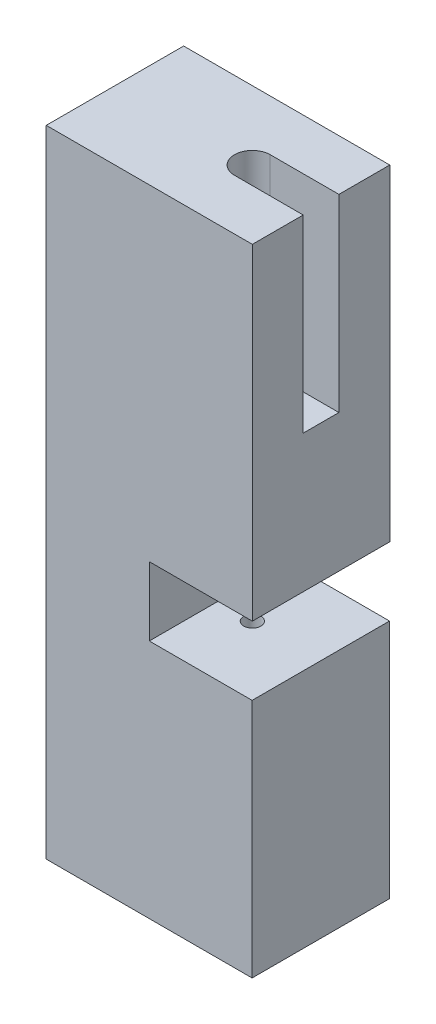
ISO-10303-21;
HEADER;
FILE_DESCRIPTION(('STEP AP214'),'2;1');
FILE_NAME('part.step','',(''),(''),'','','');
FILE_SCHEMA(('AUTOMOTIVE_DESIGN { 1 0 10303 214 1 1 1 1 }'));
ENDSEC;
DATA;
#1=APPLICATION_CONTEXT('core data for automotive mechanical design processes');
#2=APPLICATION_PROTOCOL_DEFINITION('international standard','automotive_design',2000,#1);
#3=PRODUCT_CONTEXT('',#1,'mechanical');
#4=PRODUCT('Part','Part','',(#3));
#5=PRODUCT_RELATED_PRODUCT_CATEGORY('part','',(#4));
#6=PRODUCT_DEFINITION_FORMATION('','',#4);
#7=PRODUCT_DEFINITION_CONTEXT('part definition',#1,'design');
#8=PRODUCT_DEFINITION('design','',#6,#7);
#9=PRODUCT_DEFINITION_SHAPE('','',#8);
#10=(LENGTH_UNIT() NAMED_UNIT(*) SI_UNIT(.MILLI.,.METRE.));
#11=(NAMED_UNIT(*) PLANE_ANGLE_UNIT() SI_UNIT($,.RADIAN.));
#12=(NAMED_UNIT(*) SI_UNIT($,.STERADIAN.) SOLID_ANGLE_UNIT());
#13=UNCERTAINTY_MEASURE_WITH_UNIT(LENGTH_MEASURE(1.E-05),#10,'distance_accuracy_value','');
#14=(GEOMETRIC_REPRESENTATION_CONTEXT(3) GLOBAL_UNCERTAINTY_ASSIGNED_CONTEXT((#13)) GLOBAL_UNIT_ASSIGNED_CONTEXT((#10,
#11,#12)) REPRESENTATION_CONTEXT('',''));
#15=CARTESIAN_POINT('',(0.,0.,0.));
#16=DIRECTION('',(0.,0.,1.));
#17=DIRECTION('',(1.,0.,0.));
#18=AXIS2_PLACEMENT_3D('',#15,#16,#17);
#19=CARTESIAN_POINT('',(0.,25.4,0.));
#20=DIRECTION('',(0.,-1.,0.));
#21=DIRECTION('',(0.,0.,-1.));
#22=AXIS2_PLACEMENT_3D('',#19,#20,#21);
#23=PLANE('',#22);
#24=CARTESIAN_POINT('',(6.34999999999999,25.4,0.));
#25=DIRECTION('',(0.,1.,0.));
#26=DIRECTION('',(0.,0.,1.));
#27=AXIS2_PLACEMENT_3D('',#24,#25,#26);
#28=CIRCLE('',#27,3.18);
#29=CARTESIAN_POINT('',(6.34999999999999,25.4,3.18));
#30=VERTEX_POINT('',#29);
#31=EDGE_CURVE('E242',#30,#30,#28,.T.);
#32=ORIENTED_EDGE('',*,*,#31,.F.);
#33=EDGE_LOOP('',(#32));
#34=FACE_BOUND('',#33,.T.);
#35=DIRECTION('',(-1.,0.,0.));
#36=VECTOR('',#35,1.);
#37=CARTESIAN_POINT('',(6.34999999999999,25.4,3.302));
#38=LINE('',#37,#36);
#39=CARTESIAN_POINT('',(19.05,25.4,3.302));
#40=VERTEX_POINT('',#39);
#41=CARTESIAN_POINT('',(6.34999999999999,25.4,3.302));
#42=VERTEX_POINT('',#41);
#43=EDGE_CURVE('E146',#40,#42,#38,.T.);
#44=ORIENTED_EDGE('',*,*,#43,.F.);
#45=DIRECTION('',(0.,0.,-1.));
#46=VECTOR('',#45,1.);
#47=CARTESIAN_POINT('',(19.05,25.4,12.7));
#48=LINE('',#47,#46);
#49=CARTESIAN_POINT('',(19.05,25.4,-3.302));
#50=VERTEX_POINT('',#49);
#51=EDGE_CURVE('E202',#40,#50,#48,.T.);
#52=ORIENTED_EDGE('',*,*,#51,.T.);
#53=DIRECTION('',(1.,0.,0.));
#54=VECTOR('',#53,1.);
#55=CARTESIAN_POINT('',(6.34999999999999,25.4,-3.302));
#56=LINE('',#55,#54);
#57=CARTESIAN_POINT('',(6.34999999999999,25.4,-3.302));
#58=VERTEX_POINT('',#57);
#59=EDGE_CURVE('E59',#58,#50,#56,.T.);
#60=ORIENTED_EDGE('',*,*,#59,.F.);
#61=CARTESIAN_POINT('',(6.34999999999999,25.4,0.));
#62=DIRECTION('',(0.,-1.,0.));
#63=DIRECTION('',(0.,0.,1.));
#64=AXIS2_PLACEMENT_3D('',#61,#62,#63);
#65=CIRCLE('',#64,3.302);
#66=EDGE_CURVE('E54',#42,#58,#65,.T.);
#67=ORIENTED_EDGE('',*,*,#66,.F.);
#68=EDGE_LOOP('',(#44,#52,#60,#67));
#69=FACE_BOUND('',#68,.T.);
#70=ADVANCED_FACE('F37',(#34,#69),#23,.F.);
#71=CARTESIAN_POINT('',(19.05,25.4,12.7));
#72=DIRECTION('',(-1.,0.,0.));
#73=DIRECTION('',(0.,0.,1.));
#74=AXIS2_PLACEMENT_3D('',#71,#72,#73);
#75=PLANE('',#74);
#76=DIRECTION('',(0.,0.,-1.));
#77=VECTOR('',#76,1.);
#78=CARTESIAN_POINT('',(19.05,0.,12.7));
#79=LINE('',#78,#77);
#80=CARTESIAN_POINT('',(19.05,0.,12.7));
#81=VERTEX_POINT('',#80);
#82=CARTESIAN_POINT('',(19.05,0.,-12.7));
#83=VERTEX_POINT('',#82);
#84=EDGE_CURVE('E212',#81,#83,#79,.T.);
#85=ORIENTED_EDGE('',*,*,#84,.T.);
#86=DIRECTION('',(0.,-1.,0.));
#87=VECTOR('',#86,1.);
#88=CARTESIAN_POINT('',(19.05,25.4,-12.7));
#89=LINE('',#88,#87);
#90=CARTESIAN_POINT('',(19.05,60.325,-12.7));
#91=VERTEX_POINT('',#90);
#92=EDGE_CURVE('E11',#91,#83,#89,.T.);
#93=ORIENTED_EDGE('',*,*,#92,.F.);
#94=DIRECTION('',(0.,0.,-1.));
#95=VECTOR('',#94,1.);
#96=CARTESIAN_POINT('',(19.05,60.325,-3.302));
#97=LINE('',#96,#95);
#98=CARTESIAN_POINT('',(19.05,60.325,-3.302));
#99=VERTEX_POINT('',#98);
#100=EDGE_CURVE('E136',#99,#91,#97,.T.);
#101=ORIENTED_EDGE('',*,*,#100,.F.);
#102=DIRECTION('',(0.,-1.,0.));
#103=VECTOR('',#102,1.);
#104=CARTESIAN_POINT('',(19.05,60.325,-3.302));
#105=LINE('',#104,#103);
#106=EDGE_CURVE('E132',#99,#50,#105,.T.);
#107=ORIENTED_EDGE('',*,*,#106,.T.);
#108=ORIENTED_EDGE('',*,*,#51,.F.);
#109=DIRECTION('',(0.,-1.,0.));
#110=VECTOR('',#109,1.);
#111=CARTESIAN_POINT('',(19.05,60.325,3.302));
#112=LINE('',#111,#110);
#113=CARTESIAN_POINT('',(19.05,60.325,3.302));
#114=VERTEX_POINT('',#113);
#115=EDGE_CURVE('E154',#114,#40,#112,.T.);
#116=ORIENTED_EDGE('',*,*,#115,.F.);
#117=DIRECTION('',(0.,0.,-1.));
#118=VECTOR('',#117,1.);
#119=CARTESIAN_POINT('',(19.05,60.325,3.302));
#120=LINE('',#119,#118);
#121=CARTESIAN_POINT('',(19.05,60.325,12.7));
#122=VERTEX_POINT('',#121);
#123=EDGE_CURVE('E341',#122,#114,#120,.T.);
#124=ORIENTED_EDGE('',*,*,#123,.F.);
#125=DIRECTION('',(0.,-1.,0.));
#126=VECTOR('',#125,1.);
#127=CARTESIAN_POINT('',(19.05,25.4,12.7));
#128=LINE('',#127,#126);
#129=EDGE_CURVE('E205',#122,#81,#128,.T.);
#130=ORIENTED_EDGE('',*,*,#129,.T.);
#131=EDGE_LOOP('',(#85,#93,#101,#107,#108,#116,#124,#130));
#132=FACE_BOUND('',#131,.T.);
#133=ADVANCED_FACE('F39',(#132),#75,.F.);
#134=CARTESIAN_POINT('',(-19.05,25.4,-12.7));
#135=DIRECTION('',(0.,0.,1.));
#136=DIRECTION('',(1.,0.,0.));
#137=AXIS2_PLACEMENT_3D('',#134,#135,#136);
#138=PLANE('',#137);
#139=DIRECTION('',(-1.,0.,0.));
#140=VECTOR('',#139,1.);
#141=CARTESIAN_POINT('',(-19.05,0.,-12.7));
#142=LINE('',#141,#140);
#143=CARTESIAN_POINT('',(0.,0.,-12.7));
#144=VERTEX_POINT('',#143);
#145=EDGE_CURVE('E215',#83,#144,#142,.T.);
#146=ORIENTED_EDGE('',*,*,#145,.T.);
#147=DIRECTION('',(0.,1.,0.));
#148=VECTOR('',#147,1.);
#149=CARTESIAN_POINT('',(0.,-12.7,-12.7));
#150=LINE('',#149,#148);
#151=CARTESIAN_POINT('',(0.,-12.7,-12.7));
#152=VERTEX_POINT('',#151);
#153=EDGE_CURVE('E231',#152,#144,#150,.T.);
#154=ORIENTED_EDGE('',*,*,#153,.F.);
#155=DIRECTION('',(1.,0.,0.));
#156=VECTOR('',#155,1.);
#157=CARTESIAN_POINT('',(-19.05,-12.7,-12.7));
#158=LINE('',#157,#156);
#159=CARTESIAN_POINT('',(19.0049783903987,-12.7,-12.7));
#160=VERTEX_POINT('',#159);
#161=EDGE_CURVE('E166',#152,#160,#158,.T.);
#162=ORIENTED_EDGE('',*,*,#161,.T.);
#163=DIRECTION('',(0.,1.,0.));
#164=VECTOR('',#163,1.);
#165=CARTESIAN_POINT('',(19.0049783903987,-57.15,-12.7));
#166=LINE('',#165,#164);
#167=CARTESIAN_POINT('',(19.0049783903987,-57.15,-12.7));
#168=VERTEX_POINT('',#167);
#169=EDGE_CURVE('E228',#168,#160,#166,.T.);
#170=ORIENTED_EDGE('',*,*,#169,.F.);
#171=DIRECTION('',(1.,0.,0.));
#172=VECTOR('',#171,1.);
#173=CARTESIAN_POINT('',(-19.05,-57.15,-12.7));
#174=LINE('',#173,#172);
#175=CARTESIAN_POINT('',(-19.05,-57.15,-12.7));
#176=VERTEX_POINT('',#175);
#177=EDGE_CURVE('E170',#176,#168,#174,.T.);
#178=ORIENTED_EDGE('',*,*,#177,.F.);
#179=DIRECTION('',(0.,-1.,0.));
#180=VECTOR('',#179,1.);
#181=CARTESIAN_POINT('',(-19.05,25.4,-12.7));
#182=LINE('',#181,#180);
#183=CARTESIAN_POINT('',(-19.05,60.325,-12.7));
#184=VERTEX_POINT('',#183);
#185=EDGE_CURVE('E46',#184,#176,#182,.T.);
#186=ORIENTED_EDGE('',*,*,#185,.F.);
#187=DIRECTION('',(-1.,0.,0.));
#188=VECTOR('',#187,1.);
#189=CARTESIAN_POINT('',(-19.05,60.325,-12.7));
#190=LINE('',#189,#188);
#191=EDGE_CURVE('E347',#91,#184,#190,.T.);
#192=ORIENTED_EDGE('',*,*,#191,.F.);
#193=ORIENTED_EDGE('',*,*,#92,.T.);
#194=EDGE_LOOP('',(#146,#154,#162,#170,#178,#186,#192,#193));
#195=FACE_BOUND('',#194,.T.);
#196=ADVANCED_FACE('F294',(#195),#138,.F.);
#197=CARTESIAN_POINT('',(-19.05,25.4,12.7));
#198=DIRECTION('',(1.,0.,0.));
#199=DIRECTION('',(0.,0.,-1.));
#200=AXIS2_PLACEMENT_3D('',#197,#198,#199);
#201=PLANE('',#200);
#202=CARTESIAN_POINT('',(-19.05,12.7,0.));
#203=DIRECTION('',(-1.,0.,0.));
#204=DIRECTION('',(0.,0.,1.));
#205=AXIS2_PLACEMENT_3D('',#202,#203,#204);
#206=CIRCLE('',#205,2.7051);
#207=CARTESIAN_POINT('',(-19.05,12.7,2.7051));
#208=VERTEX_POINT('',#207);
#209=EDGE_CURVE('E249',#208,#208,#206,.T.);
#210=ORIENTED_EDGE('',*,*,#209,.F.);
#211=EDGE_LOOP('',(#210));
#212=FACE_BOUND('',#211,.T.);
#213=ORIENTED_EDGE('',*,*,#185,.T.);
#214=DIRECTION('',(0.,0.,-1.));
#215=VECTOR('',#214,1.);
#216=CARTESIAN_POINT('',(-19.05,-57.15,12.7));
#217=LINE('',#216,#215);
#218=CARTESIAN_POINT('',(-19.05,-57.15,12.7));
#219=VERTEX_POINT('',#218);
#220=EDGE_CURVE('E167',#219,#176,#217,.T.);
#221=ORIENTED_EDGE('',*,*,#220,.F.);
#222=DIRECTION('',(0.,-1.,0.));
#223=VECTOR('',#222,1.);
#224=CARTESIAN_POINT('',(-19.05,25.4,12.7));
#225=LINE('',#224,#223);
#226=CARTESIAN_POINT('',(-19.05,60.325,12.7));
#227=VERTEX_POINT('',#226);
#228=EDGE_CURVE('E333',#227,#219,#225,.T.);
#229=ORIENTED_EDGE('',*,*,#228,.F.);
#230=DIRECTION('',(0.,0.,1.));
#231=VECTOR('',#230,1.);
#232=CARTESIAN_POINT('',(-19.05,60.325,12.7));
#233=LINE('',#232,#231);
#234=EDGE_CURVE('E335',#184,#227,#233,.T.);
#235=ORIENTED_EDGE('',*,*,#234,.F.);
#236=EDGE_LOOP('',(#213,#221,#229,#235));
#237=FACE_BOUND('',#236,.T.);
#238=ADVANCED_FACE('F300',(#212,#237),#201,.F.);
#239=CARTESIAN_POINT('',(-19.05,25.4,12.7));
#240=DIRECTION('',(0.,0.,-1.));
#241=DIRECTION('',(-1.,0.,0.));
#242=AXIS2_PLACEMENT_3D('',#239,#240,#241);
#243=PLANE('',#242);
#244=ORIENTED_EDGE('',*,*,#228,.T.);
#245=DIRECTION('',(-1.,0.,0.));
#246=VECTOR('',#245,1.);
#247=CARTESIAN_POINT('',(19.0049783903987,-57.15,12.7));
#248=LINE('',#247,#246);
#249=CARTESIAN_POINT('',(19.0049783903987,-57.15,12.7));
#250=VERTEX_POINT('',#249);
#251=EDGE_CURVE('E175',#250,#219,#248,.T.);
#252=ORIENTED_EDGE('',*,*,#251,.F.);
#253=DIRECTION('',(0.,1.,0.));
#254=VECTOR('',#253,1.);
#255=CARTESIAN_POINT('',(19.0049783903987,-57.15,12.7));
#256=LINE('',#255,#254);
#257=CARTESIAN_POINT('',(19.0049783903987,-12.7,12.7));
#258=VERTEX_POINT('',#257);
#259=EDGE_CURVE('E178',#250,#258,#256,.T.);
#260=ORIENTED_EDGE('',*,*,#259,.T.);
#261=DIRECTION('',(-1.,0.,0.));
#262=VECTOR('',#261,1.);
#263=CARTESIAN_POINT('',(19.0049783903987,-12.7,12.7));
#264=LINE('',#263,#262);
#265=CARTESIAN_POINT('',(0.,-12.7,12.7));
#266=VERTEX_POINT('',#265);
#267=EDGE_CURVE('E171',#258,#266,#264,.T.);
#268=ORIENTED_EDGE('',*,*,#267,.T.);
#269=DIRECTION('',(0.,1.,0.));
#270=VECTOR('',#269,1.);
#271=CARTESIAN_POINT('',(0.,-12.7,12.7));
#272=LINE('',#271,#270);
#273=CARTESIAN_POINT('',(0.,0.,12.7));
#274=VERTEX_POINT('',#273);
#275=EDGE_CURVE('E196',#266,#274,#272,.T.);
#276=ORIENTED_EDGE('',*,*,#275,.T.);
#277=DIRECTION('',(1.,0.,0.));
#278=VECTOR('',#277,1.);
#279=CARTESIAN_POINT('',(-19.05,0.,12.7));
#280=LINE('',#279,#278);
#281=EDGE_CURVE('E206',#274,#81,#280,.T.);
#282=ORIENTED_EDGE('',*,*,#281,.T.);
#283=ORIENTED_EDGE('',*,*,#129,.F.);
#284=DIRECTION('',(1.,0.,0.));
#285=VECTOR('',#284,1.);
#286=CARTESIAN_POINT('',(19.05,60.325,12.7));
#287=LINE('',#286,#285);
#288=EDGE_CURVE('E344',#227,#122,#287,.T.);
#289=ORIENTED_EDGE('',*,*,#288,.F.);
#290=EDGE_LOOP('',(#244,#252,#260,#268,#276,#282,#283,#289));
#291=FACE_BOUND('',#290,.T.);
#292=ADVANCED_FACE('F285',(#291),#243,.F.);
#293=CARTESIAN_POINT('',(0.,0.,0.));
#294=DIRECTION('',(0.,-1.,0.));
#295=DIRECTION('',(0.,0.,-1.));
#296=AXIS2_PLACEMENT_3D('',#293,#294,#295);
#297=PLANE('',#296);
#298=DIRECTION('',(0.,0.,1.));
#299=VECTOR('',#298,1.);
#300=CARTESIAN_POINT('',(0.,0.,-12.7));
#301=LINE('',#300,#299);
#302=EDGE_CURVE('E197',#144,#274,#301,.T.);
#303=ORIENTED_EDGE('',*,*,#302,.F.);
#304=ORIENTED_EDGE('',*,*,#145,.F.);
#305=ORIENTED_EDGE('',*,*,#84,.F.);
#306=ORIENTED_EDGE('',*,*,#281,.F.);
#307=EDGE_LOOP('',(#303,#304,#305,#306));
#308=FACE_BOUND('',#307,.T.);
#309=CARTESIAN_POINT('',(6.34999999999999,0.,0.));
#310=DIRECTION('',(0.,-1.,0.));
#311=DIRECTION('',(0.,0.,-1.));
#312=AXIS2_PLACEMENT_3D('',#309,#310,#311);
#313=CIRCLE('',#312,1.5875);
#314=CARTESIAN_POINT('',(6.34999999999999,0.,-1.5875));
#315=VERTEX_POINT('',#314);
#316=EDGE_CURVE('E234',#315,#315,#313,.T.);
#317=ORIENTED_EDGE('',*,*,#316,.F.);
#318=EDGE_LOOP('',(#317));
#319=FACE_BOUND('',#318,.T.);
#320=ADVANCED_FACE('F280',(#308,#319),#297,.T.);
#321=CARTESIAN_POINT('',(-1.82,12.7,0.));
#322=DIRECTION('',(-1.,0.,0.));
#323=DIRECTION('',(0.,0.,1.));
#324=AXIS2_PLACEMENT_3D('',#321,#322,#323);
#325=CONICAL_SURFACE('',#324,2.7051,1.02974425867665);
#326=CARTESIAN_POINT('',(-1.82,12.7,0.));
#327=DIRECTION('',(-1.,0.,0.));
#328=DIRECTION('',(0.,0.,1.));
#329=AXIS2_PLACEMENT_3D('',#326,#327,#328);
#330=CIRCLE('',#329,2.7051);
#331=CARTESIAN_POINT('',(-1.82,12.7,2.7051));
#332=VERTEX_POINT('',#331);
#333=EDGE_CURVE('E210',#332,#332,#330,.T.);
#334=ORIENTED_EDGE('',*,*,#333,.T.);
#335=EDGE_LOOP('',(#334));
#336=FACE_BOUND('',#335,.T.);
#337=CARTESIAN_POINT('',(-1.1484781721748,12.7,0.));
#338=DIRECTION('',(-1.,0.,0.));
#339=DIRECTION('',(0.,0.,1.));
#340=AXIS2_PLACEMENT_3D('',#337,#338,#339);
#341=CIRCLE('',#340,1.5875);
#342=CARTESIAN_POINT('',(-1.1484781721748,12.7,1.5875));
#343=VERTEX_POINT('',#342);
#344=EDGE_CURVE('E216',#343,#343,#341,.T.);
#345=ORIENTED_EDGE('',*,*,#344,.F.);
#346=EDGE_LOOP('',(#345));
#347=FACE_BOUND('',#346,.T.);
#348=ADVANCED_FACE('F277',(#336,#347),#325,.F.);
#349=CARTESIAN_POINT('',(-19.05,12.7,0.));
#350=DIRECTION('',(-1.,0.,0.));
#351=DIRECTION('',(0.,0.,1.));
#352=AXIS2_PLACEMENT_3D('',#349,#350,#351);
#353=CYLINDRICAL_SURFACE('',#352,2.7051);
#354=ORIENTED_EDGE('',*,*,#333,.F.);
#355=EDGE_LOOP('',(#354));
#356=FACE_BOUND('',#355,.T.);
#357=ORIENTED_EDGE('',*,*,#209,.T.);
#358=EDGE_LOOP('',(#357));
#359=FACE_BOUND('',#358,.T.);
#360=ADVANCED_FACE('F275',(#356,#359),#353,.F.);
#361=CARTESIAN_POINT('',(6.35,12.7,0.));
#362=DIRECTION('',(-1.,0.,0.));
#363=DIRECTION('',(0.,0.,1.));
#364=AXIS2_PLACEMENT_3D('',#361,#362,#363);
#365=CYLINDRICAL_SURFACE('',#364,1.5875);
#366=CARTESIAN_POINT('',(3.59459735247278,12.7,1.5875));
#367=CARTESIAN_POINT('',(3.59459017973115,12.6172586451815,1.58749424352326));
#368=CARTESIAN_POINT('',(3.59081379270054,12.5344123573323,1.58098805091278));
#369=CARTESIAN_POINT('',(3.57625445945613,12.3712609331309,1.55529417728205));
#370=CARTESIAN_POINT('',(3.56545674467661,12.2909615280847,1.53607976450222));
#371=CARTESIAN_POINT('',(3.53841847516626,12.1355716685185,1.48600354904247));
#372=CARTESIAN_POINT('',(3.52220683202264,12.0604560495693,1.45520350806727));
#373=CARTESIAN_POINT('',(3.48621220218651,11.9164772370036,1.38301884589355));
#374=CARTESIAN_POINT('',(3.46642903195907,11.8476143649792,1.34163368069724));
#375=CARTESIAN_POINT('',(3.42353292885979,11.7118440015256,1.24546401127066));
#376=CARTESIAN_POINT('',(3.40027996086801,11.6455625972824,1.18985768475747));
#377=CARTESIAN_POINT('',(3.35419481091718,11.5227798929066,1.06853328284142));
#378=CARTESIAN_POINT('',(3.33136284330224,11.4662834580961,1.00281020764799));
#379=CARTESIAN_POINT('',(3.28685847808196,11.360961824106,0.857724983900029));
#380=CARTESIAN_POINT('',(3.26536687018225,11.312906398233,0.777743356355027));
#381=CARTESIAN_POINT('',(3.22778228141889,11.2312185260838,0.609557105389736));
#382=CARTESIAN_POINT('',(3.21168590540129,11.1975770055885,0.521357698151404));
#383=CARTESIAN_POINT('',(3.18771457578681,11.1481502513833,0.345872396540025));
#384=CARTESIAN_POINT('',(3.17933723296006,11.1312672267198,0.258965884567842));
#385=CARTESIAN_POINT('',(3.16987262306143,11.1122219707399,0.0831811124203533));
#386=CARTESIAN_POINT('',(3.16878096091756,11.1100508644766,-0.00569592656257327));
#387=CARTESIAN_POINT('',(3.17377207384302,11.1200661320866,-0.174647475104287));
#388=CARTESIAN_POINT('',(3.17924107276919,11.1310241157808,-0.254817124449576));
#389=CARTESIAN_POINT('',(3.19581219524633,11.1647890080791,-0.412002819966045));
#390=CARTESIAN_POINT('',(3.20691474020997,11.1875968031013,-0.489018629751079));
#391=CARTESIAN_POINT('',(3.23392807500225,11.2445632875032,-0.639056107868877));
#392=CARTESIAN_POINT('',(3.24990341674929,11.2788750199864,-0.712007564890726));
#393=CARTESIAN_POINT('',(3.28522120367903,11.3576645687765,-0.851293928775306));
#394=CARTESIAN_POINT('',(3.30456485498222,11.4021460284395,-0.917626452108219));
#395=CARTESIAN_POINT('',(3.34695473281455,11.5048320693497,-1.04846685880464));
#396=CARTESIAN_POINT('',(3.37017809939693,11.5639352328471,-1.11221270222715));
#397=CARTESIAN_POINT('',(3.41653797397157,11.6917812534189,-1.22929818245982));
#398=CARTESIAN_POINT('',(3.43967440233729,11.760531418167,-1.28262985652666));
#399=CARTESIAN_POINT('',(3.48482268882283,11.9110365592306,-1.38067211668293));
#400=CARTESIAN_POINT('',(3.50667124180246,11.9933386428224,-1.42462551406329));
#401=CARTESIAN_POINT('',(3.54448607037906,12.1655131829884,-1.49773248108117));
#402=CARTESIAN_POINT('',(3.56045846359268,12.2553776459481,-1.52690145467056));
#403=CARTESIAN_POINT('',(3.58293846121488,12.4326412863022,-1.56724860622443));
#404=CARTESIAN_POINT('',(3.59009525222214,12.5196724266027,-1.57966823448581));
#405=CARTESIAN_POINT('',(3.59597898000884,12.6948487252,-1.58990943690627));
#406=CARTESIAN_POINT('',(3.59471182848113,12.7829930589395,-1.58774124838393));
#407=CARTESIAN_POINT('',(3.58457936408537,12.94766195798,-1.57000789995042));
#408=CARTESIAN_POINT('',(3.5765563554147,13.0244067507227,-1.55592709614486));
#409=CARTESIAN_POINT('',(3.55505914774963,13.1742990175549,-1.51696959876538));
#410=CARTESIAN_POINT('',(3.5415831905134,13.2474453228123,-1.49208942286734));
#411=CARTESIAN_POINT('',(3.50996663190253,13.3919196717243,-1.43102747427171));
#412=CARTESIAN_POINT('',(3.4916388369675,13.4630064531439,-1.39437548647248));
#413=CARTESIAN_POINT('',(3.45255105832485,13.5984311680242,-1.31122057310551));
#414=CARTESIAN_POINT('',(3.43178982816571,13.6627656105492,-1.26471258916849));
#415=CARTESIAN_POINT('',(3.38704059457924,13.7913113395254,-1.15633902713417));
#416=CARTESIAN_POINT('',(3.36297478295081,13.8544925973242,-1.09327829186976));
#417=CARTESIAN_POINT('',(3.31658705563695,13.9696981239001,-0.957069080559218));
#418=CARTESIAN_POINT('',(3.29426572472186,14.0217186615848,-0.883917244386321));
#419=CARTESIAN_POINT('',(3.25312475028506,14.1142693182605,-0.72698308960269));
#420=CARTESIAN_POINT('',(3.23441160133442,14.1544644199909,-0.642973300455064));
#421=CARTESIAN_POINT('',(3.20340547382718,14.2197514379056,-0.468181532553601));
#422=CARTESIAN_POINT('',(3.1911068764652,14.2448565750436,-0.377405560558901));
#423=CARTESIAN_POINT('',(3.17520986541585,14.2770933180386,-0.200631930742875));
#424=CARTESIAN_POINT('',(3.17091790575939,14.2856602409293,-0.114957875348021));
#425=CARTESIAN_POINT('',(3.16934893418396,14.2888052046608,0.0566986290222037));
#426=CARTESIAN_POINT('',(3.17206948238109,14.2833881110034,0.142680960343026));
#427=CARTESIAN_POINT('',(3.18381556240842,14.2596710385933,0.306578938234516));
#428=CARTESIAN_POINT('',(3.19241607544889,14.2422388855655,0.384653888868625));
#429=CARTESIAN_POINT('',(3.21466655569703,14.1961544416323,0.536644645906985));
#430=CARTESIAN_POINT('',(3.22831724919192,14.1675005368458,0.6105598523189));
#431=CARTESIAN_POINT('',(3.26016376584061,14.0985062120038,0.755691196560387));
#432=CARTESIAN_POINT('',(3.27852931342509,14.0577175548832,0.826655881706155));
#433=CARTESIAN_POINT('',(3.31788266979807,13.9661749117067,0.961027907457518));
#434=CARTESIAN_POINT('',(3.33887168193045,13.9154163464585,1.02443175377236));
#435=CARTESIAN_POINT('',(3.38384275960468,13.7995336377291,1.14851463256916));
#436=CARTESIAN_POINT('',(3.40791513752554,13.7334837307898,1.20829873425025));
#437=CARTESIAN_POINT('',(3.45460340160479,13.5919291585893,1.31626265509524));
#438=CARTESIAN_POINT('',(3.47721799344547,13.5164162619043,1.36443226335599));
#439=CARTESIAN_POINT('',(3.51893220161945,13.3549548593926,1.44905309202634));
#440=CARTESIAN_POINT('',(3.5379005157957,13.2687547108248,1.48509294153698));
#441=CARTESIAN_POINT('',(3.56846262003712,13.0903067674611,1.54159277685558));
#442=CARTESIAN_POINT('',(3.58008105831814,12.9980803427105,1.5621048818226));
#443=CARTESIAN_POINT('',(3.58952400815211,12.8707121092778,1.5786666263393));
#444=CARTESIAN_POINT('',(3.59141986080972,12.8366886801025,1.58197404174185));
#445=CARTESIAN_POINT('',(3.59395805863416,12.7684494966913,1.58639199272779));
#446=CARTESIAN_POINT('',(3.59460032015078,12.7342337297739,1.58750238170706));
#447=CARTESIAN_POINT('',(3.59459735247278,12.7,1.5875));
#448=B_SPLINE_CURVE_WITH_KNOTS('',3,(#366,#367,#368,#369,#370,#371,#372,#373,#374,#375,#376,
#377,#378,#379,#380,#381,#382,#383,#384,#385,#386,#387,#388,#389,#390,#391,#392,#393,#394,#395,
#396,#397,#398,#399,#400,#401,#402,#403,#404,#405,#406,#407,#408,#409,#410,#411,#412,#413,#414,
#415,#416,#417,#418,#419,#420,#421,#422,#423,#424,#425,#426,#427,#428,#429,#430,#431,#432,#433,
#434,#435,#436,#437,#438,#439,#440,#441,#442,#443,#444,#445,#446,#447),.UNSPECIFIED.,.T.,.F.,(4,
2,2,2,2,2,2,2,2,2,2,2,2,2,2,2,2,2,2,2,2,2,2,2,2,2,2,2,2,2,2,2,2,2,2,2,2,2,2,2,4),(0.,
0.248080020271847,0.496683543991013,0.743980151316304,0.991289470428681,1.25892872375786,
1.52670067407902,1.81245176451593,2.0980226961702,2.36332722852483,2.62847170198454,
2.87062973089973,3.11280587691319,3.35834086805633,3.60396396157384,3.87275128477826,
4.14174332668465,4.4277236947209,4.71340548295741,4.97647097858047,5.23935188152003,
5.47361049557589,5.70794470394838,5.95313604978692,6.1984535406753,6.47457780486636,
6.75079423563348,7.03421370092675,7.31738448715514,7.57462555781747,7.83177713786769,
8.07207098604627,8.31239940531318,8.56302803138897,8.81377204185594,9.08940124036585,
9.36527188239796,9.64972845486001,9.93322595761687,10.0358607011136,10.1385022930347),.UNSPECIFIED.);
#449=CARTESIAN_POINT('',(3.59459735247278,12.7,1.5875));
#450=VERTEX_POINT('',#449);
#451=EDGE_CURVE('E247',#450,#450,#448,.T.);
#452=ORIENTED_EDGE('',*,*,#451,.T.);
#453=EDGE_LOOP('',(#452));
#454=FACE_BOUND('',#453,.T.);
#455=ORIENTED_EDGE('',*,*,#344,.T.);
#456=EDGE_LOOP('',(#455));
#457=FACE_BOUND('',#456,.T.);
#458=ADVANCED_FACE('F263',(#454,#457),#365,.F.);
#459=CARTESIAN_POINT('',(6.34999999999999,9.525,0.));
#460=DIRECTION('',(0.,1.,0.));
#461=DIRECTION('',(0.,0.,1.));
#462=AXIS2_PLACEMENT_3D('',#459,#460,#461);
#463=CYLINDRICAL_SURFACE('',#462,3.18);
#464=ORIENTED_EDGE('',*,*,#31,.T.);
#465=EDGE_LOOP('',(#464));
#466=FACE_BOUND('',#465,.T.);
#467=CARTESIAN_POINT('',(6.34999999999999,9.525,0.));
#468=DIRECTION('',(0.,1.,0.));
#469=DIRECTION('',(0.,0.,1.));
#470=AXIS2_PLACEMENT_3D('',#467,#468,#469);
#471=CIRCLE('',#470,3.18);
#472=CARTESIAN_POINT('',(6.34999999999999,9.525,3.18));
#473=VERTEX_POINT('',#472);
#474=EDGE_CURVE('E244',#473,#473,#471,.T.);
#475=ORIENTED_EDGE('',*,*,#474,.F.);
#476=EDGE_LOOP('',(#475));
#477=FACE_BOUND('',#476,.T.);
#478=ORIENTED_EDGE('',*,*,#451,.F.);
#479=EDGE_LOOP('',(#478));
#480=FACE_BOUND('',#479,.T.);
#481=ADVANCED_FACE('F267',(#466,#477,#480),#463,.F.);
#482=CARTESIAN_POINT('',(6.34999999999999,9.525,0.));
#483=DIRECTION('',(0.,1.,0.));
#484=DIRECTION('',(0.,0.,1.));
#485=AXIS2_PLACEMENT_3D('',#482,#483,#484);
#486=PLANE('',#485);
#487=CARTESIAN_POINT('',(6.34999999999999,9.525,0.));
#488=DIRECTION('',(0.,1.,0.));
#489=DIRECTION('',(0.,0.,1.));
#490=AXIS2_PLACEMENT_3D('',#487,#488,#489);
#491=CIRCLE('',#490,1.5875);
#492=CARTESIAN_POINT('',(6.34999999999999,9.525,1.5875));
#493=VERTEX_POINT('',#492);
#494=EDGE_CURVE('E238',#493,#493,#491,.T.);
#495=ORIENTED_EDGE('',*,*,#494,.F.);
#496=EDGE_LOOP('',(#495));
#497=FACE_BOUND('',#496,.T.);
#498=ORIENTED_EDGE('',*,*,#474,.T.);
#499=EDGE_LOOP('',(#498));
#500=FACE_BOUND('',#499,.T.);
#501=ADVANCED_FACE('F272',(#497,#500),#486,.T.);
#502=CARTESIAN_POINT('',(6.34999999999999,25.4,0.));
#503=DIRECTION('',(0.,-1.,0.));
#504=DIRECTION('',(0.,0.,-1.));
#505=AXIS2_PLACEMENT_3D('',#502,#503,#504);
#506=CYLINDRICAL_SURFACE('',#505,1.5875);
#507=ORIENTED_EDGE('',*,*,#494,.T.);
#508=EDGE_LOOP('',(#507));
#509=FACE_BOUND('',#508,.T.);
#510=ORIENTED_EDGE('',*,*,#316,.T.);
#511=EDGE_LOOP('',(#510));
#512=FACE_BOUND('',#511,.T.);
#513=ADVANCED_FACE('F393',(#509,#512),#506,.F.);
#514=CARTESIAN_POINT('',(0.,-12.7,-12.7));
#515=DIRECTION('',(-1.,0.,0.));
#516=DIRECTION('',(0.,0.,1.));
#517=AXIS2_PLACEMENT_3D('',#514,#515,#516);
#518=PLANE('',#517);
#519=ORIENTED_EDGE('',*,*,#302,.T.);
#520=ORIENTED_EDGE('',*,*,#275,.F.);
#521=DIRECTION('',(0.,0.,1.));
#522=VECTOR('',#521,1.);
#523=CARTESIAN_POINT('',(0.,-12.7,-12.7));
#524=LINE('',#523,#522);
#525=EDGE_CURVE('E192',#152,#266,#524,.T.);
#526=ORIENTED_EDGE('',*,*,#525,.F.);
#527=ORIENTED_EDGE('',*,*,#153,.T.);
#528=EDGE_LOOP('',(#519,#520,#526,#527));
#529=FACE_BOUND('',#528,.T.);
#530=ADVANCED_FACE('F312',(#529),#518,.F.);
#531=CARTESIAN_POINT('',(0.,-12.7,0.));
#532=DIRECTION('',(0.,-1.,0.));
#533=DIRECTION('',(0.,0.,-1.));
#534=AXIS2_PLACEMENT_3D('',#531,#532,#533);
#535=PLANE('',#534);
#536=CARTESIAN_POINT('',(6.34999999999999,-12.7,0.));
#537=DIRECTION('',(0.,1.,0.));
#538=DIRECTION('',(0.,0.,1.));
#539=AXIS2_PLACEMENT_3D('',#536,#537,#538);
#540=CIRCLE('',#539,1.5875);
#541=CARTESIAN_POINT('',(6.34999999999999,-12.7,1.5875));
#542=VERTEX_POINT('',#541);
#543=EDGE_CURVE('E163',#542,#542,#540,.T.);
#544=ORIENTED_EDGE('',*,*,#543,.F.);
#545=EDGE_LOOP('',(#544));
#546=FACE_BOUND('',#545,.T.);
#547=ORIENTED_EDGE('',*,*,#161,.F.);
#548=ORIENTED_EDGE('',*,*,#525,.T.);
#549=ORIENTED_EDGE('',*,*,#267,.F.);
#550=DIRECTION('',(0.,0.,1.));
#551=VECTOR('',#550,1.);
#552=CARTESIAN_POINT('',(19.0049783903987,-12.7,-12.7));
#553=LINE('',#552,#551);
#554=EDGE_CURVE('E181',#160,#258,#553,.T.);
#555=ORIENTED_EDGE('',*,*,#554,.F.);
#556=EDGE_LOOP('',(#547,#548,#549,#555));
#557=FACE_BOUND('',#556,.T.);
#558=ADVANCED_FACE('F326',(#546,#557),#535,.F.);
#559=CARTESIAN_POINT('',(19.0049783903987,-57.15,-12.7));
#560=DIRECTION('',(-1.,0.,0.));
#561=DIRECTION('',(0.,0.,1.));
#562=AXIS2_PLACEMENT_3D('',#559,#560,#561);
#563=PLANE('',#562);
#564=ORIENTED_EDGE('',*,*,#554,.T.);
#565=ORIENTED_EDGE('',*,*,#259,.F.);
#566=DIRECTION('',(0.,0.,1.));
#567=VECTOR('',#566,1.);
#568=CARTESIAN_POINT('',(19.0049783903987,-57.15,-12.7));
#569=LINE('',#568,#567);
#570=EDGE_CURVE('E173',#168,#250,#569,.T.);
#571=ORIENTED_EDGE('',*,*,#570,.F.);
#572=ORIENTED_EDGE('',*,*,#169,.T.);
#573=EDGE_LOOP('',(#564,#565,#571,#572));
#574=FACE_BOUND('',#573,.T.);
#575=ADVANCED_FACE('F323',(#574),#563,.F.);
#576=CARTESIAN_POINT('',(0.,-57.15,0.));
#577=DIRECTION('',(0.,-1.,0.));
#578=DIRECTION('',(0.,0.,-1.));
#579=AXIS2_PLACEMENT_3D('',#576,#577,#578);
#580=PLANE('',#579);
#581=CARTESIAN_POINT('',(6.34999999999999,-57.15,0.));
#582=DIRECTION('',(0.,-1.,0.));
#583=DIRECTION('',(0.,0.,-1.));
#584=AXIS2_PLACEMENT_3D('',#581,#582,#583);
#585=CIRCLE('',#584,2.70509999999999);
#586=CARTESIAN_POINT('',(6.34999999999999,-57.15,-2.70509999999999));
#587=VERTEX_POINT('',#586);
#588=EDGE_CURVE('E149',#587,#587,#585,.T.);
#589=ORIENTED_EDGE('',*,*,#588,.F.);
#590=EDGE_LOOP('',(#589));
#591=FACE_BOUND('',#590,.T.);
#592=ORIENTED_EDGE('',*,*,#220,.T.);
#593=ORIENTED_EDGE('',*,*,#177,.T.);
#594=ORIENTED_EDGE('',*,*,#570,.T.);
#595=ORIENTED_EDGE('',*,*,#251,.T.);
#596=EDGE_LOOP('',(#592,#593,#594,#595));
#597=FACE_BOUND('',#596,.T.);
#598=ADVANCED_FACE('F329',(#591,#597),#580,.T.);
#599=CARTESIAN_POINT('',(6.34999999999999,-57.15,0.));
#600=DIRECTION('',(0.,1.,0.));
#601=DIRECTION('',(0.,0.,1.));
#602=AXIS2_PLACEMENT_3D('',#599,#600,#601);
#603=CYLINDRICAL_SURFACE('',#602,1.5875);
#604=CARTESIAN_POINT('',(6.34999999999999,-39.2484781721748,0.));
#605=DIRECTION('',(0.,-1.,0.));
#606=DIRECTION('',(0.,0.,-1.));
#607=AXIS2_PLACEMENT_3D('',#604,#605,#606);
#608=CIRCLE('',#607,1.5875);
#609=CARTESIAN_POINT('',(6.34999999999999,-39.2484781721748,-1.5875));
#610=VERTEX_POINT('',#609);
#611=EDGE_CURVE('E162',#610,#610,#608,.T.);
#612=ORIENTED_EDGE('',*,*,#611,.T.);
#613=EDGE_LOOP('',(#612));
#614=FACE_BOUND('',#613,.T.);
#615=ORIENTED_EDGE('',*,*,#543,.T.);
#616=EDGE_LOOP('',(#615));
#617=FACE_BOUND('',#616,.T.);
#618=ADVANCED_FACE('F379',(#614,#617),#603,.F.);
#619=CARTESIAN_POINT('',(6.34999999999999,-39.92,0.));
#620=DIRECTION('',(0.,-1.,0.));
#621=DIRECTION('',(0.,0.,-1.));
#622=AXIS2_PLACEMENT_3D('',#619,#620,#621);
#623=CONICAL_SURFACE('',#622,2.70509999999999,1.02974425867665);
#624=CARTESIAN_POINT('',(6.34999999999999,-39.92,0.));
#625=DIRECTION('',(0.,-1.,0.));
#626=DIRECTION('',(0.,0.,-1.));
#627=AXIS2_PLACEMENT_3D('',#624,#625,#626);
#628=CIRCLE('',#627,2.70509999999999);
#629=CARTESIAN_POINT('',(6.34999999999999,-39.92,-2.70509999999999));
#630=VERTEX_POINT('',#629);
#631=EDGE_CURVE('E152',#630,#630,#628,.T.);
#632=ORIENTED_EDGE('',*,*,#631,.T.);
#633=EDGE_LOOP('',(#632));
#634=FACE_BOUND('',#633,.T.);
#635=ORIENTED_EDGE('',*,*,#611,.F.);
#636=EDGE_LOOP('',(#635));
#637=FACE_BOUND('',#636,.T.);
#638=ADVANCED_FACE('F375',(#634,#637),#623,.F.);
#639=CARTESIAN_POINT('',(6.34999999999999,-57.15,0.));
#640=DIRECTION('',(0.,-1.,0.));
#641=DIRECTION('',(0.,0.,-1.));
#642=AXIS2_PLACEMENT_3D('',#639,#640,#641);
#643=CYLINDRICAL_SURFACE('',#642,2.70509999999999);
#644=ORIENTED_EDGE('',*,*,#631,.F.);
#645=EDGE_LOOP('',(#644));
#646=FACE_BOUND('',#645,.T.);
#647=ORIENTED_EDGE('',*,*,#588,.T.);
#648=EDGE_LOOP('',(#647));
#649=FACE_BOUND('',#648,.T.);
#650=ADVANCED_FACE('F372',(#646,#649),#643,.F.);
#651=CARTESIAN_POINT('',(6.34999999999999,60.325,0.));
#652=DIRECTION('',(0.,-1.,0.));
#653=DIRECTION('',(0.,0.,-1.));
#654=AXIS2_PLACEMENT_3D('',#651,#652,#653);
#655=CYLINDRICAL_SURFACE('',#654,3.302);
#656=ORIENTED_EDGE('',*,*,#66,.T.);
#657=DIRECTION('',(0.,-1.,0.));
#658=VECTOR('',#657,1.);
#659=CARTESIAN_POINT('',(6.34999999999999,60.325,-3.302));
#660=LINE('',#659,#658);
#661=CARTESIAN_POINT('',(6.34999999999999,60.325,-3.302));
#662=VERTEX_POINT('',#661);
#663=EDGE_CURVE('E130',#662,#58,#660,.T.);
#664=ORIENTED_EDGE('',*,*,#663,.F.);
#665=CARTESIAN_POINT('',(6.34999999999999,60.325,0.));
#666=DIRECTION('',(0.,-1.,0.));
#667=DIRECTION('',(0.,0.,1.));
#668=AXIS2_PLACEMENT_3D('',#665,#666,#667);
#669=CIRCLE('',#668,3.302);
#670=CARTESIAN_POINT('',(6.34999999999999,60.325,3.302));
#671=VERTEX_POINT('',#670);
#672=EDGE_CURVE('E137',#671,#662,#669,.T.);
#673=ORIENTED_EDGE('',*,*,#672,.F.);
#674=DIRECTION('',(0.,-1.,0.));
#675=VECTOR('',#674,1.);
#676=CARTESIAN_POINT('',(6.34999999999999,60.325,3.302));
#677=LINE('',#676,#675);
#678=EDGE_CURVE('E157',#671,#42,#677,.T.);
#679=ORIENTED_EDGE('',*,*,#678,.T.);
#680=EDGE_LOOP('',(#656,#664,#673,#679));
#681=FACE_BOUND('',#680,.T.);
#682=ADVANCED_FACE('F148',(#681),#655,.F.);
#683=CARTESIAN_POINT('',(6.34999999999999,60.325,-3.302));
#684=DIRECTION('',(0.,0.,-1.));
#685=DIRECTION('',(-1.,0.,0.));
#686=AXIS2_PLACEMENT_3D('',#683,#684,#685);
#687=PLANE('',#686);
#688=ORIENTED_EDGE('',*,*,#59,.T.);
#689=ORIENTED_EDGE('',*,*,#106,.F.);
#690=DIRECTION('',(1.,0.,0.));
#691=VECTOR('',#690,1.);
#692=CARTESIAN_POINT('',(6.34999999999999,60.325,-3.302));
#693=LINE('',#692,#691);
#694=EDGE_CURVE('E126',#662,#99,#693,.T.);
#695=ORIENTED_EDGE('',*,*,#694,.F.);
#696=ORIENTED_EDGE('',*,*,#663,.T.);
#697=EDGE_LOOP('',(#688,#689,#695,#696));
#698=FACE_BOUND('',#697,.T.);
#699=ADVANCED_FACE('F128',(#698),#687,.F.);
#700=CARTESIAN_POINT('',(6.34999999999999,60.325,3.302));
#701=DIRECTION('',(0.,0.,1.));
#702=DIRECTION('',(1.,0.,0.));
#703=AXIS2_PLACEMENT_3D('',#700,#701,#702);
#704=PLANE('',#703);
#705=ORIENTED_EDGE('',*,*,#43,.T.);
#706=ORIENTED_EDGE('',*,*,#678,.F.);
#707=DIRECTION('',(-1.,0.,0.));
#708=VECTOR('',#707,1.);
#709=CARTESIAN_POINT('',(6.34999999999999,60.325,3.302));
#710=LINE('',#709,#708);
#711=EDGE_CURVE('E142',#114,#671,#710,.T.);
#712=ORIENTED_EDGE('',*,*,#711,.F.);
#713=ORIENTED_EDGE('',*,*,#115,.T.);
#714=EDGE_LOOP('',(#705,#706,#712,#713));
#715=FACE_BOUND('',#714,.T.);
#716=ADVANCED_FACE('F360',(#715),#704,.F.);
#717=CARTESIAN_POINT('',(6.34999999999999,60.325,0.));
#718=DIRECTION('',(0.,1.,0.));
#719=DIRECTION('',(0.,0.,1.));
#720=AXIS2_PLACEMENT_3D('',#717,#718,#719);
#721=PLANE('',#720);
#722=ORIENTED_EDGE('',*,*,#672,.T.);
#723=ORIENTED_EDGE('',*,*,#694,.T.);
#724=ORIENTED_EDGE('',*,*,#100,.T.);
#725=ORIENTED_EDGE('',*,*,#191,.T.);
#726=ORIENTED_EDGE('',*,*,#234,.T.);
#727=ORIENTED_EDGE('',*,*,#288,.T.);
#728=ORIENTED_EDGE('',*,*,#123,.T.);
#729=ORIENTED_EDGE('',*,*,#711,.T.);
#730=EDGE_LOOP('',(#722,#723,#724,#725,#726,#727,#728,#729));
#731=FACE_BOUND('',#730,.T.);
#732=ADVANCED_FACE('F140',(#731),#721,.T.);
#733=CLOSED_SHELL('',(#70,#133,#196,#238,#292,#320,#348,#360,#458,#481,#501,#513,#530,#558,#575,
#598,#618,#638,#650,#682,#699,#716,#732));
#734=MANIFOLD_SOLID_BREP('B2',#733);
#735=ADVANCED_BREP_SHAPE_REPRESENTATION('',(#18,#734),#14);
#736=SHAPE_DEFINITION_REPRESENTATION(#9,#735);
ENDSEC;
END-ISO-10303-21;
